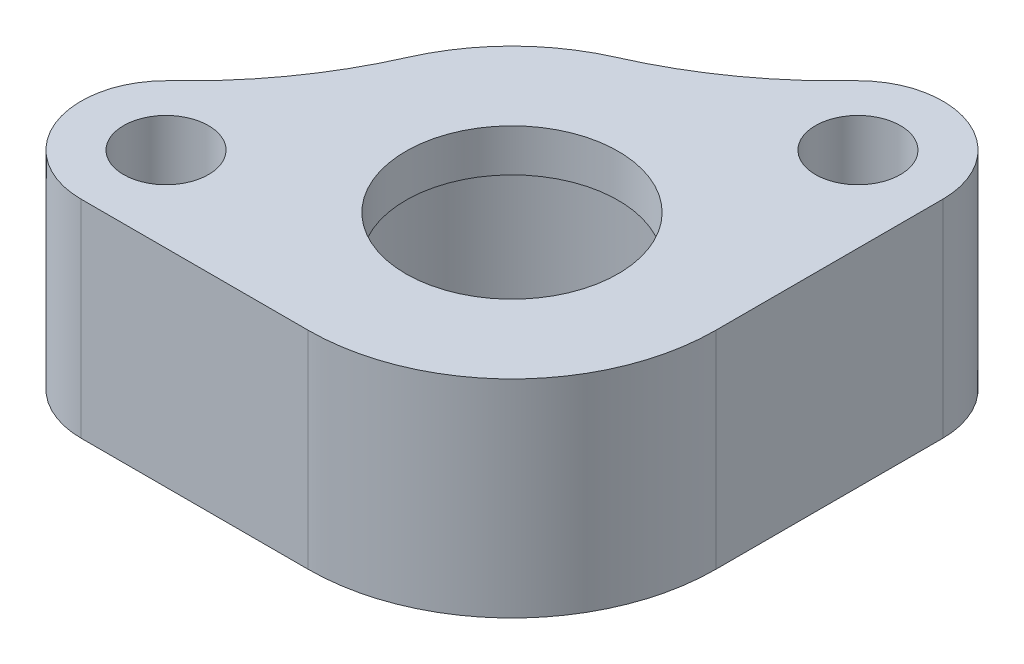
ISO-10303-21;
HEADER;
FILE_DESCRIPTION(('STEP AP214'),'2;1');
FILE_NAME('part.step','',(''),(''),'','','');
FILE_SCHEMA(('AUTOMOTIVE_DESIGN { 1 0 10303 214 1 1 1 1 }'));
ENDSEC;
DATA;
#1=APPLICATION_CONTEXT('core data for automotive mechanical design processes');
#2=APPLICATION_PROTOCOL_DEFINITION('international standard','automotive_design',2000,#1);
#3=PRODUCT_CONTEXT('',#1,'mechanical');
#4=PRODUCT('Part','Part','',(#3));
#5=PRODUCT_RELATED_PRODUCT_CATEGORY('part','',(#4));
#6=PRODUCT_DEFINITION_FORMATION('','',#4);
#7=PRODUCT_DEFINITION_CONTEXT('part definition',#1,'design');
#8=PRODUCT_DEFINITION('design','',#6,#7);
#9=PRODUCT_DEFINITION_SHAPE('','',#8);
#10=(LENGTH_UNIT() NAMED_UNIT(*) SI_UNIT(.MILLI.,.METRE.));
#11=(NAMED_UNIT(*) PLANE_ANGLE_UNIT() SI_UNIT($,.RADIAN.));
#12=(NAMED_UNIT(*) SI_UNIT($,.STERADIAN.) SOLID_ANGLE_UNIT());
#13=UNCERTAINTY_MEASURE_WITH_UNIT(LENGTH_MEASURE(1.E-05),#10,'distance_accuracy_value','');
#14=(GEOMETRIC_REPRESENTATION_CONTEXT(3) GLOBAL_UNCERTAINTY_ASSIGNED_CONTEXT((#13)) GLOBAL_UNIT_ASSIGNED_CONTEXT((#10,
#11,#12)) REPRESENTATION_CONTEXT('',''));
#15=CARTESIAN_POINT('',(0.,0.,0.));
#16=DIRECTION('',(0.,0.,1.));
#17=DIRECTION('',(1.,0.,0.));
#18=AXIS2_PLACEMENT_3D('',#15,#16,#17);
#19=CARTESIAN_POINT('',(0.,7.75,0.));
#20=DIRECTION('',(0.,-1.,0.));
#21=DIRECTION('',(0.,0.,-1.));
#22=AXIS2_PLACEMENT_3D('',#19,#20,#21);
#23=CYLINDRICAL_SURFACE('',#22,9.6);
#24=CARTESIAN_POINT('',(0.,0.,0.));
#25=DIRECTION('',(0.,1.,0.));
#26=DIRECTION('',(0.,0.,1.));
#27=AXIS2_PLACEMENT_3D('',#24,#25,#26);
#28=CIRCLE('',#27,9.6);
#29=CARTESIAN_POINT('',(0.,0.,9.6));
#30=VERTEX_POINT('',#29);
#31=CARTESIAN_POINT('',(9.6,0.,0.));
#32=VERTEX_POINT('',#31);
#33=EDGE_CURVE('E116',#30,#32,#28,.T.);
#34=ORIENTED_EDGE('',*,*,#33,.T.);
#35=DIRECTION('',(0.,-1.,0.));
#36=VECTOR('',#35,1.);
#37=CARTESIAN_POINT('',(9.6,7.75,0.));
#38=LINE('',#37,#36);
#39=CARTESIAN_POINT('',(9.6,9.75,0.));
#40=VERTEX_POINT('',#39);
#41=EDGE_CURVE('E111',#40,#32,#38,.T.);
#42=ORIENTED_EDGE('',*,*,#41,.F.);
#43=CARTESIAN_POINT('',(0.,9.75,0.));
#44=DIRECTION('',(0.,1.,0.));
#45=DIRECTION('',(0.,0.,1.));
#46=AXIS2_PLACEMENT_3D('',#43,#44,#45);
#47=CIRCLE('',#46,9.6);
#48=CARTESIAN_POINT('',(0.,9.75,9.6));
#49=VERTEX_POINT('',#48);
#50=EDGE_CURVE('E114',#49,#40,#47,.T.);
#51=ORIENTED_EDGE('',*,*,#50,.F.);
#52=DIRECTION('',(0.,-1.,0.));
#53=VECTOR('',#52,1.);
#54=CARTESIAN_POINT('',(0.,7.75,9.6));
#55=LINE('',#54,#53);
#56=EDGE_CURVE('E185',#49,#30,#55,.T.);
#57=ORIENTED_EDGE('',*,*,#56,.T.);
#58=EDGE_LOOP('',(#34,#42,#51,#57));
#59=FACE_BOUND('',#58,.T.);
#60=ADVANCED_FACE('F34',(#59),#23,.T.);
#61=CARTESIAN_POINT('',(9.6,7.75,0.));
#62=DIRECTION('',(-1.,0.,0.));
#63=DIRECTION('',(0.,0.,1.));
#64=AXIS2_PLACEMENT_3D('',#61,#62,#63);
#65=PLANE('',#64);
#66=DIRECTION('',(0.,0.,-1.));
#67=VECTOR('',#66,1.);
#68=CARTESIAN_POINT('',(9.6,0.,0.));
#69=LINE('',#68,#67);
#70=CARTESIAN_POINT('',(9.60000000000003,0.,-10.6911688245431));
#71=VERTEX_POINT('',#70);
#72=EDGE_CURVE('E157',#32,#71,#69,.T.);
#73=ORIENTED_EDGE('',*,*,#72,.T.);
#74=DIRECTION('',(0.,-1.,0.));
#75=VECTOR('',#74,1.);
#76=CARTESIAN_POINT('',(9.60000000000003,7.75,-10.6911688245431));
#77=LINE('',#76,#75);
#78=CARTESIAN_POINT('',(9.60000000000003,9.75,-10.6911688245431));
#79=VERTEX_POINT('',#78);
#80=EDGE_CURVE('E119',#79,#71,#77,.T.);
#81=ORIENTED_EDGE('',*,*,#80,.F.);
#82=DIRECTION('',(0.,0.,-1.));
#83=VECTOR('',#82,1.);
#84=CARTESIAN_POINT('',(9.6,9.75,0.));
#85=LINE('',#84,#83);
#86=EDGE_CURVE('E122',#40,#79,#85,.T.);
#87=ORIENTED_EDGE('',*,*,#86,.F.);
#88=ORIENTED_EDGE('',*,*,#41,.T.);
#89=EDGE_LOOP('',(#73,#81,#87,#88));
#90=FACE_BOUND('',#89,.T.);
#91=ADVANCED_FACE('F123',(#90),#65,.F.);
#92=CARTESIAN_POINT('',(5.60000000000003,7.75,-10.6911688245431));
#93=DIRECTION('',(0.,-1.,0.));
#94=DIRECTION('',(0.,0.,-1.));
#95=AXIS2_PLACEMENT_3D('',#92,#93,#94);
#96=CYLINDRICAL_SURFACE('',#95,4.);
#97=CARTESIAN_POINT('',(5.60000000000003,0.,-10.6911688245431));
#98=DIRECTION('',(0.,1.,0.));
#99=DIRECTION('',(0.,0.,1.));
#100=AXIS2_PLACEMENT_3D('',#97,#98,#99);
#101=CIRCLE('',#100,4.);
#102=CARTESIAN_POINT('',(2.77157287525385,0.,-13.5195959492893));
#103=VERTEX_POINT('',#102);
#104=EDGE_CURVE('E159',#71,#103,#101,.T.);
#105=ORIENTED_EDGE('',*,*,#104,.T.);
#106=DIRECTION('',(0.,-1.,0.));
#107=VECTOR('',#106,1.);
#108=CARTESIAN_POINT('',(2.77157287525385,7.75,-13.5195959492893));
#109=LINE('',#108,#107);
#110=CARTESIAN_POINT('',(2.77157287525385,9.75,-13.5195959492893));
#111=VERTEX_POINT('',#110);
#112=EDGE_CURVE('E191',#111,#103,#109,.T.);
#113=ORIENTED_EDGE('',*,*,#112,.F.);
#114=CARTESIAN_POINT('',(5.60000000000003,9.75,-10.6911688245431));
#115=DIRECTION('',(0.,1.,0.));
#116=DIRECTION('',(0.,0.,1.));
#117=AXIS2_PLACEMENT_3D('',#114,#115,#116);
#118=CIRCLE('',#117,4.);
#119=EDGE_CURVE('E127',#79,#111,#118,.T.);
#120=ORIENTED_EDGE('',*,*,#119,.F.);
#121=ORIENTED_EDGE('',*,*,#80,.T.);
#122=EDGE_LOOP('',(#105,#113,#120,#121));
#123=FACE_BOUND('',#122,.T.);
#124=ADVANCED_FACE('F226',(#123),#96,.T.);
#125=CARTESIAN_POINT('',(-5.37401153701775,7.75,-5.37401153701777));
#126=DIRECTION('',(-0.707106781186546,0.,-0.707106781186549));
#127=DIRECTION('',(-0.707106781186549,0.,0.707106781186546));
#128=AXIS2_PLACEMENT_3D('',#125,#126,#127);
#129=PLANE('',#128);
#130=DIRECTION('',(0.707106781186549,0.,-0.707106781186546));
#131=VECTOR('',#130,1.);
#132=CARTESIAN_POINT('',(-5.37401153701775,0.,-5.37401153701777));
#133=LINE('',#132,#131);
#134=CARTESIAN_POINT('',(2.18905662345788,0.,-12.9370796974934));
#135=VERTEX_POINT('',#134);
#136=EDGE_CURVE('E162',#135,#103,#133,.T.);
#137=ORIENTED_EDGE('',*,*,#136,.F.);
#138=DIRECTION('',(0.,-1.,0.));
#139=VECTOR('',#138,1.);
#140=CARTESIAN_POINT('',(2.18905662345788,7.75,-12.9370796974934));
#141=LINE('',#140,#139);
#142=CARTESIAN_POINT('',(2.18905662345788,9.75,-12.9370796974934));
#143=VERTEX_POINT('',#142);
#144=EDGE_CURVE('E199',#135,#143,#141,.F.);
#145=ORIENTED_EDGE('',*,*,#144,.T.);
#146=DIRECTION('',(-0.707106781186549,0.,0.707106781186546));
#147=VECTOR('',#146,1.);
#148=CARTESIAN_POINT('',(2.77157287525385,9.75,-13.5195959492893));
#149=LINE('',#148,#147);
#150=EDGE_CURVE('E143',#111,#143,#149,.T.);
#151=ORIENTED_EDGE('',*,*,#150,.F.);
#152=ORIENTED_EDGE('',*,*,#112,.T.);
#153=EDGE_LOOP('',(#137,#145,#151,#152));
#154=FACE_BOUND('',#153,.T.);
#155=ADVANCED_FACE('F231',(#154),#129,.T.);
#156=CARTESIAN_POINT('',(0.,7.75,0.));
#157=DIRECTION('',(0.,-1.,0.));
#158=DIRECTION('',(0.,0.,-1.));
#159=AXIS2_PLACEMENT_3D('',#156,#157,#158);
#160=CYLINDRICAL_SURFACE('',#159,9.6);
#161=CARTESIAN_POINT('',(0.,9.75,0.));
#162=DIRECTION('',(0.,1.,0.));
#163=DIRECTION('',(0.,0.,1.));
#164=AXIS2_PLACEMENT_3D('',#161,#162,#163);
#165=CIRCLE('',#164,9.6);
#166=CARTESIAN_POINT('',(-3.87667427035883,9.75,-8.78244821228898));
#167=VERTEX_POINT('',#166);
#168=CARTESIAN_POINT('',(-8.78244821228897,9.75,-3.87667427035886));
#169=VERTEX_POINT('',#168);
#170=EDGE_CURVE('E146',#167,#169,#165,.T.);
#171=ORIENTED_EDGE('',*,*,#170,.F.);
#172=DIRECTION('',(0.,-1.,0.));
#173=VECTOR('',#172,1.);
#174=CARTESIAN_POINT('',(-3.87667427035883,7.75,-8.78244821228898));
#175=LINE('',#174,#173);
#176=CARTESIAN_POINT('',(-3.87667427035883,0.,-8.78244821228898));
#177=VERTEX_POINT('',#176);
#178=EDGE_CURVE('E196',#167,#177,#175,.T.);
#179=ORIENTED_EDGE('',*,*,#178,.T.);
#180=CARTESIAN_POINT('',(0.,0.,0.));
#181=DIRECTION('',(0.,1.,0.));
#182=DIRECTION('',(0.,0.,1.));
#183=AXIS2_PLACEMENT_3D('',#180,#181,#182);
#184=CIRCLE('',#183,9.6);
#185=CARTESIAN_POINT('',(-8.78244821228897,0.,-3.87667427035886));
#186=VERTEX_POINT('',#185);
#187=EDGE_CURVE('E164',#177,#186,#184,.T.);
#188=ORIENTED_EDGE('',*,*,#187,.T.);
#189=DIRECTION('',(0.,-1.,0.));
#190=VECTOR('',#189,1.);
#191=CARTESIAN_POINT('',(-8.78244821228897,7.75,-3.87667427035886));
#192=LINE('',#191,#190);
#193=EDGE_CURVE('E118',#186,#169,#192,.F.);
#194=ORIENTED_EDGE('',*,*,#193,.T.);
#195=EDGE_LOOP('',(#171,#179,#188,#194));
#196=FACE_BOUND('',#195,.T.);
#197=ADVANCED_FACE('F213',(#196),#160,.T.);
#198=CARTESIAN_POINT('',(-5.37401153701775,7.75,-5.37401153701777));
#199=DIRECTION('',(-0.707106781186546,0.,-0.707106781186549));
#200=DIRECTION('',(-0.707106781186549,0.,0.707106781186546));
#201=AXIS2_PLACEMENT_3D('',#198,#199,#200);
#202=PLANE('',#201);
#203=DIRECTION('',(-0.707106781186548,0.,0.707106781186547));
#204=VECTOR('',#203,1.);
#205=CARTESIAN_POINT('',(-9.52129980768331,9.75,-1.22672326635223));
#206=LINE('',#205,#204);
#207=CARTESIAN_POINT('',(-12.9370796974934,9.75,2.18905662345784));
#208=VERTEX_POINT('',#207);
#209=CARTESIAN_POINT('',(-13.5195959492894,9.75,2.77157287525381));
#210=VERTEX_POINT('',#209);
#211=EDGE_CURVE('E148',#208,#210,#206,.T.);
#212=ORIENTED_EDGE('',*,*,#211,.F.);
#213=DIRECTION('',(0.,-1.,0.));
#214=VECTOR('',#213,1.);
#215=CARTESIAN_POINT('',(-12.9370796974934,7.75,2.18905662345784));
#216=LINE('',#215,#214);
#217=CARTESIAN_POINT('',(-12.9370796974934,0.,2.18905662345784));
#218=VERTEX_POINT('',#217);
#219=EDGE_CURVE('E201',#208,#218,#216,.T.);
#220=ORIENTED_EDGE('',*,*,#219,.T.);
#221=DIRECTION('',(0.707106781186549,0.,-0.707106781186546));
#222=VECTOR('',#221,1.);
#223=CARTESIAN_POINT('',(-5.37401153701775,0.,-5.37401153701777));
#224=LINE('',#223,#222);
#225=CARTESIAN_POINT('',(-13.5195959492894,0.,2.77157287525381));
#226=VERTEX_POINT('',#225);
#227=EDGE_CURVE('E167',#226,#218,#224,.T.);
#228=ORIENTED_EDGE('',*,*,#227,.F.);
#229=DIRECTION('',(0.,-1.,0.));
#230=VECTOR('',#229,1.);
#231=CARTESIAN_POINT('',(-13.5195959492894,7.75,2.77157287525381));
#232=LINE('',#231,#230);
#233=EDGE_CURVE('E189',#210,#226,#232,.T.);
#234=ORIENTED_EDGE('',*,*,#233,.F.);
#235=EDGE_LOOP('',(#212,#220,#228,#234));
#236=FACE_BOUND('',#235,.T.);
#237=ADVANCED_FACE('F216',(#236),#202,.T.);
#238=CARTESIAN_POINT('',(-10.6911688245432,7.75,5.6));
#239=DIRECTION('',(0.,-1.,0.));
#240=DIRECTION('',(0.,0.,-1.));
#241=AXIS2_PLACEMENT_3D('',#238,#239,#240);
#242=CYLINDRICAL_SURFACE('',#241,4.);
#243=CARTESIAN_POINT('',(-10.6911688245432,0.,5.6));
#244=DIRECTION('',(0.,1.,0.));
#245=DIRECTION('',(0.,0.,1.));
#246=AXIS2_PLACEMENT_3D('',#243,#244,#245);
#247=CIRCLE('',#246,4.);
#248=CARTESIAN_POINT('',(-10.6911688245432,0.,9.6));
#249=VERTEX_POINT('',#248);
#250=EDGE_CURVE('E170',#249,#226,#247,.F.);
#251=ORIENTED_EDGE('',*,*,#250,.F.);
#252=DIRECTION('',(0.,-1.,0.));
#253=VECTOR('',#252,1.);
#254=CARTESIAN_POINT('',(-10.6911688245432,7.75,9.6));
#255=LINE('',#254,#253);
#256=CARTESIAN_POINT('',(-10.6911688245432,9.75,9.6));
#257=VERTEX_POINT('',#256);
#258=EDGE_CURVE('E187',#257,#249,#255,.T.);
#259=ORIENTED_EDGE('',*,*,#258,.F.);
#260=CARTESIAN_POINT('',(-10.6911688245432,9.75,5.6));
#261=DIRECTION('',(0.,1.,0.));
#262=DIRECTION('',(0.,0.,1.));
#263=AXIS2_PLACEMENT_3D('',#260,#261,#262);
#264=CIRCLE('',#263,4.);
#265=EDGE_CURVE('E150',#210,#257,#264,.T.);
#266=ORIENTED_EDGE('',*,*,#265,.F.);
#267=ORIENTED_EDGE('',*,*,#233,.T.);
#268=EDGE_LOOP('',(#251,#259,#266,#267));
#269=FACE_BOUND('',#268,.T.);
#270=ADVANCED_FACE('F258',(#269),#242,.T.);
#271=CARTESIAN_POINT('',(0.,7.75,0.));
#272=DIRECTION('',(0.,-1.,0.));
#273=DIRECTION('',(0.,0.,-1.));
#274=AXIS2_PLACEMENT_3D('',#271,#272,#273);
#275=CYLINDRICAL_SURFACE('',#274,7.6);
#276=CARTESIAN_POINT('',(0.,7.75,0.));
#277=DIRECTION('',(0.,1.,0.));
#278=DIRECTION('',(0.,0.,1.));
#279=AXIS2_PLACEMENT_3D('',#276,#277,#278);
#280=CIRCLE('',#279,7.6);
#281=CARTESIAN_POINT('',(0.,7.75,7.6));
#282=VERTEX_POINT('',#281);
#283=EDGE_CURVE('E153',#282,#282,#280,.T.);
#284=ORIENTED_EDGE('',*,*,#283,.T.);
#285=EDGE_LOOP('',(#284));
#286=FACE_BOUND('',#285,.T.);
#287=CARTESIAN_POINT('',(0.,0.,0.));
#288=DIRECTION('',(0.,1.,0.));
#289=DIRECTION('',(0.,0.,1.));
#290=AXIS2_PLACEMENT_3D('',#287,#288,#289);
#291=CIRCLE('',#290,7.6);
#292=CARTESIAN_POINT('',(0.,0.,7.6));
#293=VERTEX_POINT('',#292);
#294=EDGE_CURVE('E179',#293,#293,#291,.T.);
#295=ORIENTED_EDGE('',*,*,#294,.F.);
#296=EDGE_LOOP('',(#295));
#297=FACE_BOUND('',#296,.T.);
#298=ADVANCED_FACE('F261',(#286,#297),#275,.F.);
#299=CARTESIAN_POINT('',(-10.6911688245432,7.75,5.6));
#300=DIRECTION('',(0.,-1.,0.));
#301=DIRECTION('',(0.,0.,-1.));
#302=AXIS2_PLACEMENT_3D('',#299,#300,#301);
#303=CYLINDRICAL_SURFACE('',#302,2.);
#304=CARTESIAN_POINT('',(-10.6911688245432,0.,5.6));
#305=DIRECTION('',(0.,1.,0.));
#306=DIRECTION('',(0.,0.,1.));
#307=AXIS2_PLACEMENT_3D('',#304,#305,#306);
#308=CIRCLE('',#307,2.);
#309=CARTESIAN_POINT('',(-10.6911688245432,0.,7.6));
#310=VERTEX_POINT('',#309);
#311=EDGE_CURVE('E176',#310,#310,#308,.T.);
#312=ORIENTED_EDGE('',*,*,#311,.F.);
#313=EDGE_LOOP('',(#312));
#314=FACE_BOUND('',#313,.T.);
#315=CARTESIAN_POINT('',(-10.6911688245432,9.75,5.6));
#316=DIRECTION('',(0.,1.,0.));
#317=DIRECTION('',(0.,0.,1.));
#318=AXIS2_PLACEMENT_3D('',#315,#316,#317);
#319=CIRCLE('',#318,2.);
#320=CARTESIAN_POINT('',(-10.6911688245432,9.75,7.6));
#321=VERTEX_POINT('',#320);
#322=EDGE_CURVE('E287',#321,#321,#319,.T.);
#323=ORIENTED_EDGE('',*,*,#322,.T.);
#324=EDGE_LOOP('',(#323));
#325=FACE_BOUND('',#324,.T.);
#326=ADVANCED_FACE('F265',(#314,#325),#303,.F.);
#327=CARTESIAN_POINT('',(0.,7.75,9.6));
#328=DIRECTION('',(0.,0.,1.));
#329=DIRECTION('',(1.,0.,0.));
#330=AXIS2_PLACEMENT_3D('',#327,#328,#329);
#331=PLANE('',#330);
#332=DIRECTION('',(-1.,0.,0.));
#333=VECTOR('',#332,1.);
#334=CARTESIAN_POINT('',(0.,0.,9.6));
#335=LINE('',#334,#333);
#336=EDGE_CURVE('E173',#30,#249,#335,.T.);
#337=ORIENTED_EDGE('',*,*,#336,.F.);
#338=ORIENTED_EDGE('',*,*,#56,.F.);
#339=DIRECTION('',(1.,0.,0.));
#340=VECTOR('',#339,1.);
#341=CARTESIAN_POINT('',(-10.6911688245432,9.75,9.6));
#342=LINE('',#341,#340);
#343=EDGE_CURVE('E134',#257,#49,#342,.T.);
#344=ORIENTED_EDGE('',*,*,#343,.F.);
#345=ORIENTED_EDGE('',*,*,#258,.T.);
#346=EDGE_LOOP('',(#337,#338,#344,#345));
#347=FACE_BOUND('',#346,.T.);
#348=ADVANCED_FACE('F222',(#347),#331,.T.);
#349=CARTESIAN_POINT('',(5.60000000000003,7.75,-10.6911688245431));
#350=DIRECTION('',(0.,-1.,0.));
#351=DIRECTION('',(0.,0.,-1.));
#352=AXIS2_PLACEMENT_3D('',#349,#350,#351);
#353=CYLINDRICAL_SURFACE('',#352,2.);
#354=CARTESIAN_POINT('',(5.60000000000003,0.,-10.6911688245431));
#355=DIRECTION('',(0.,1.,0.));
#356=DIRECTION('',(0.,0.,1.));
#357=AXIS2_PLACEMENT_3D('',#354,#355,#356);
#358=CIRCLE('',#357,2.);
#359=CARTESIAN_POINT('',(5.60000000000003,0.,-8.69116882454315));
#360=VERTEX_POINT('',#359);
#361=EDGE_CURVE('E182',#360,#360,#358,.T.);
#362=ORIENTED_EDGE('',*,*,#361,.F.);
#363=EDGE_LOOP('',(#362));
#364=FACE_BOUND('',#363,.T.);
#365=CARTESIAN_POINT('',(5.60000000000003,9.75,-10.6911688245431));
#366=DIRECTION('',(0.,1.,0.));
#367=DIRECTION('',(0.,0.,1.));
#368=AXIS2_PLACEMENT_3D('',#365,#366,#367);
#369=CIRCLE('',#368,2.);
#370=CARTESIAN_POINT('',(5.60000000000003,9.75,-8.69116882454315));
#371=VERTEX_POINT('',#370);
#372=EDGE_CURVE('E289',#371,#371,#369,.T.);
#373=ORIENTED_EDGE('',*,*,#372,.T.);
#374=EDGE_LOOP('',(#373));
#375=FACE_BOUND('',#374,.T.);
#376=ADVANCED_FACE('F264',(#364,#375),#353,.F.);
#377=CARTESIAN_POINT('',(0.,0.,0.));
#378=DIRECTION('',(0.,1.,0.));
#379=DIRECTION('',(0.,0.,1.));
#380=AXIS2_PLACEMENT_3D('',#377,#378,#379);
#381=PLANE('',#380);
#382=ORIENTED_EDGE('',*,*,#33,.F.);
#383=ORIENTED_EDGE('',*,*,#336,.T.);
#384=ORIENTED_EDGE('',*,*,#250,.T.);
#385=ORIENTED_EDGE('',*,*,#227,.T.);
#386=CARTESIAN_POINT('',(-27.0792153212243,0.,-11.9530790002731));
#387=DIRECTION('',(0.,1.,0.));
#388=DIRECTION('',(0.,0.,1.));
#389=AXIS2_PLACEMENT_3D('',#386,#387,#388);
#390=CIRCLE('',#389,20.);
#391=EDGE_CURVE('E42',#218,#186,#390,.T.);
#392=ORIENTED_EDGE('',*,*,#391,.T.);
#393=ORIENTED_EDGE('',*,*,#187,.F.);
#394=CARTESIAN_POINT('',(-11.9530790002731,0.,-27.0792153212243));
#395=DIRECTION('',(0.,1.,0.));
#396=DIRECTION('',(0.,0.,1.));
#397=AXIS2_PLACEMENT_3D('',#394,#395,#396);
#398=CIRCLE('',#397,20.);
#399=EDGE_CURVE('E203',#177,#135,#398,.T.);
#400=ORIENTED_EDGE('',*,*,#399,.T.);
#401=ORIENTED_EDGE('',*,*,#136,.T.);
#402=ORIENTED_EDGE('',*,*,#104,.F.);
#403=ORIENTED_EDGE('',*,*,#72,.F.);
#404=EDGE_LOOP('',(#382,#383,#384,#385,#392,#393,#400,#401,#402,#403));
#405=FACE_BOUND('',#404,.T.);
#406=ORIENTED_EDGE('',*,*,#311,.T.);
#407=EDGE_LOOP('',(#406));
#408=FACE_BOUND('',#407,.T.);
#409=ORIENTED_EDGE('',*,*,#294,.T.);
#410=EDGE_LOOP('',(#409));
#411=FACE_BOUND('',#410,.T.);
#412=ORIENTED_EDGE('',*,*,#361,.T.);
#413=EDGE_LOOP('',(#412));
#414=FACE_BOUND('',#413,.T.);
#415=ADVANCED_FACE('F208',(#405,#408,#411,#414),#381,.F.);
#416=CARTESIAN_POINT('',(0.,7.75,0.));
#417=DIRECTION('',(0.,1.,0.));
#418=DIRECTION('',(0.,0.,1.));
#419=AXIS2_PLACEMENT_3D('',#416,#417,#418);
#420=PLANE('',#419);
#421=CARTESIAN_POINT('',(0.,7.75,0.));
#422=DIRECTION('',(0.,1.,0.));
#423=DIRECTION('',(0.,0.,1.));
#424=AXIS2_PLACEMENT_3D('',#421,#422,#423);
#425=CIRCLE('',#424,5.);
#426=CARTESIAN_POINT('',(0.,7.75,5.));
#427=VERTEX_POINT('',#426);
#428=EDGE_CURVE('E138',#427,#427,#425,.T.);
#429=ORIENTED_EDGE('',*,*,#428,.T.);
#430=EDGE_LOOP('',(#429));
#431=FACE_BOUND('',#430,.T.);
#432=ORIENTED_EDGE('',*,*,#283,.F.);
#433=EDGE_LOOP('',(#432));
#434=FACE_BOUND('',#433,.T.);
#435=ADVANCED_FACE('F277',(#431,#434),#420,.F.);
#436=CARTESIAN_POINT('',(0.,9.75,0.));
#437=DIRECTION('',(0.,1.,0.));
#438=DIRECTION('',(0.,0.,1.));
#439=AXIS2_PLACEMENT_3D('',#436,#437,#438);
#440=PLANE('',#439);
#441=ORIENTED_EDGE('',*,*,#322,.F.);
#442=EDGE_LOOP('',(#441));
#443=FACE_BOUND('',#442,.T.);
#444=ORIENTED_EDGE('',*,*,#50,.T.);
#445=ORIENTED_EDGE('',*,*,#86,.T.);
#446=ORIENTED_EDGE('',*,*,#119,.T.);
#447=ORIENTED_EDGE('',*,*,#150,.T.);
#448=CARTESIAN_POINT('',(-11.9530790002731,9.75,-27.0792153212243));
#449=DIRECTION('',(0.,1.,0.));
#450=DIRECTION('',(0.,0.,1.));
#451=AXIS2_PLACEMENT_3D('',#448,#449,#450);
#452=CIRCLE('',#451,20.);
#453=EDGE_CURVE('E205',#143,#167,#452,.F.);
#454=ORIENTED_EDGE('',*,*,#453,.T.);
#455=ORIENTED_EDGE('',*,*,#170,.T.);
#456=CARTESIAN_POINT('',(-27.0792153212243,9.75,-11.9530790002731));
#457=DIRECTION('',(0.,1.,0.));
#458=DIRECTION('',(0.,0.,1.));
#459=AXIS2_PLACEMENT_3D('',#456,#457,#458);
#460=CIRCLE('',#459,20.);
#461=EDGE_CURVE('E11',#169,#208,#460,.F.);
#462=ORIENTED_EDGE('',*,*,#461,.T.);
#463=ORIENTED_EDGE('',*,*,#211,.T.);
#464=ORIENTED_EDGE('',*,*,#265,.T.);
#465=ORIENTED_EDGE('',*,*,#343,.T.);
#466=EDGE_LOOP('',(#444,#445,#446,#447,#454,#455,#462,#463,#464,#465));
#467=FACE_BOUND('',#466,.T.);
#468=CARTESIAN_POINT('',(0.,9.75,0.));
#469=DIRECTION('',(0.,1.,0.));
#470=DIRECTION('',(0.,0.,1.));
#471=AXIS2_PLACEMENT_3D('',#468,#469,#470);
#472=CIRCLE('',#471,5.);
#473=CARTESIAN_POINT('',(0.,9.75,5.));
#474=VERTEX_POINT('',#473);
#475=EDGE_CURVE('E135',#474,#474,#472,.T.);
#476=ORIENTED_EDGE('',*,*,#475,.F.);
#477=EDGE_LOOP('',(#476));
#478=FACE_BOUND('',#477,.T.);
#479=ORIENTED_EDGE('',*,*,#372,.F.);
#480=EDGE_LOOP('',(#479));
#481=FACE_BOUND('',#480,.T.);
#482=ADVANCED_FACE('F130',(#443,#467,#478,#481),#440,.T.);
#483=CARTESIAN_POINT('',(0.,9.75,0.));
#484=DIRECTION('',(0.,-1.,0.));
#485=DIRECTION('',(0.,0.,-1.));
#486=AXIS2_PLACEMENT_3D('',#483,#484,#485);
#487=CYLINDRICAL_SURFACE('',#486,5.);
#488=ORIENTED_EDGE('',*,*,#475,.T.);
#489=EDGE_LOOP('',(#488));
#490=FACE_BOUND('',#489,.T.);
#491=ORIENTED_EDGE('',*,*,#428,.F.);
#492=EDGE_LOOP('',(#491));
#493=FACE_BOUND('',#492,.T.);
#494=ADVANCED_FACE('F236',(#490,#493),#487,.F.);
#495=CARTESIAN_POINT('',(-11.9530790002731,7.75,-27.0792153212243));
#496=DIRECTION('',(0.,-1.,0.));
#497=DIRECTION('',(0.,0.,-1.));
#498=AXIS2_PLACEMENT_3D('',#495,#496,#497);
#499=CYLINDRICAL_SURFACE('',#498,20.);
#500=ORIENTED_EDGE('',*,*,#453,.F.);
#501=ORIENTED_EDGE('',*,*,#144,.F.);
#502=ORIENTED_EDGE('',*,*,#399,.F.);
#503=ORIENTED_EDGE('',*,*,#178,.F.);
#504=EDGE_LOOP('',(#500,#501,#502,#503));
#505=FACE_BOUND('',#504,.T.);
#506=ADVANCED_FACE('F234',(#505),#499,.F.);
#507=CARTESIAN_POINT('',(-27.0792153212243,7.75,-11.9530790002731));
#508=DIRECTION('',(0.,-1.,0.));
#509=DIRECTION('',(0.,0.,-1.));
#510=AXIS2_PLACEMENT_3D('',#507,#508,#509);
#511=CYLINDRICAL_SURFACE('',#510,20.);
#512=ORIENTED_EDGE('',*,*,#461,.F.);
#513=ORIENTED_EDGE('',*,*,#193,.F.);
#514=ORIENTED_EDGE('',*,*,#391,.F.);
#515=ORIENTED_EDGE('',*,*,#219,.F.);
#516=EDGE_LOOP('',(#512,#513,#514,#515));
#517=FACE_BOUND('',#516,.T.);
#518=ADVANCED_FACE('F36',(#517),#511,.F.);
#519=CLOSED_SHELL('',(#60,#91,#124,#155,#197,#237,#270,#298,#326,#348,#376,#415,#435,#482,#494,
#506,#518));
#520=MANIFOLD_SOLID_BREP('B2',#519);
#521=ADVANCED_BREP_SHAPE_REPRESENTATION('',(#18,#520),#14);
#522=SHAPE_DEFINITION_REPRESENTATION(#9,#521);
ENDSEC;
END-ISO-10303-21;
